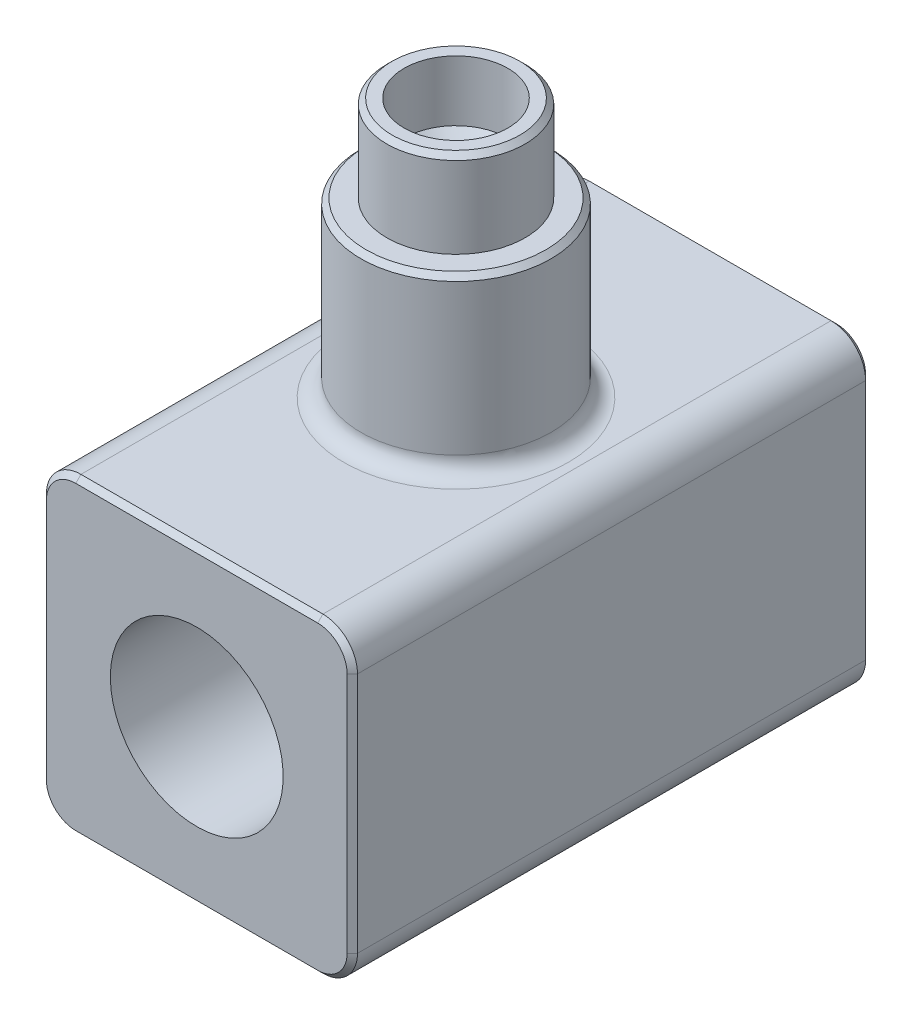
ISO-10303-21;
HEADER;
FILE_DESCRIPTION(('STEP AP214'),'2;1');
FILE_NAME('part.step','',(''),(''),'','','');
FILE_SCHEMA(('AUTOMOTIVE_DESIGN { 1 0 10303 214 1 1 1 1 }'));
ENDSEC;
DATA;
#1=APPLICATION_CONTEXT('core data for automotive mechanical design processes');
#2=APPLICATION_PROTOCOL_DEFINITION('international standard','automotive_design',2000,#1);
#3=PRODUCT_CONTEXT('',#1,'mechanical');
#4=PRODUCT('Part','Part','',(#3));
#5=PRODUCT_RELATED_PRODUCT_CATEGORY('part','',(#4));
#6=PRODUCT_DEFINITION_FORMATION('','',#4);
#7=PRODUCT_DEFINITION_CONTEXT('part definition',#1,'design');
#8=PRODUCT_DEFINITION('design','',#6,#7);
#9=PRODUCT_DEFINITION_SHAPE('','',#8);
#10=(LENGTH_UNIT() NAMED_UNIT(*) SI_UNIT(.MILLI.,.METRE.));
#11=(NAMED_UNIT(*) PLANE_ANGLE_UNIT() SI_UNIT($,.RADIAN.));
#12=(NAMED_UNIT(*) SI_UNIT($,.STERADIAN.) SOLID_ANGLE_UNIT());
#13=UNCERTAINTY_MEASURE_WITH_UNIT(LENGTH_MEASURE(1.E-05),#10,'distance_accuracy_value','');
#14=(GEOMETRIC_REPRESENTATION_CONTEXT(3) GLOBAL_UNCERTAINTY_ASSIGNED_CONTEXT((#13)) GLOBAL_UNIT_ASSIGNED_CONTEXT((#10,
#11,#12)) REPRESENTATION_CONTEXT('',''));
#15=CARTESIAN_POINT('',(0.,0.,0.));
#16=DIRECTION('',(0.,0.,1.));
#17=DIRECTION('',(1.,0.,0.));
#18=AXIS2_PLACEMENT_3D('',#15,#16,#17);
#19=CARTESIAN_POINT('',(-9.,-9.00000000000001,30.));
#20=DIRECTION('',(1.,0.,0.));
#21=DIRECTION('',(0.,0.,-1.));
#22=AXIS2_PLACEMENT_3D('',#19,#20,#21);
#23=PLANE('',#22);
#24=DIRECTION('',(0.,0.,-1.));
#25=VECTOR('',#24,1.);
#26=CARTESIAN_POINT('',(-9.,-7.00000000000001,30.));
#27=LINE('',#26,#25);
#28=CARTESIAN_POINT('',(-9.,-7.00000000000001,0.300000000000009));
#29=VERTEX_POINT('',#28);
#30=CARTESIAN_POINT('',(-9.,-7.00000000000001,29.7));
#31=VERTEX_POINT('',#30);
#32=EDGE_CURVE('E413',#29,#31,#27,.F.);
#33=ORIENTED_EDGE('',*,*,#32,.T.);
#34=DIRECTION('',(0.,1.,0.));
#35=VECTOR('',#34,1.);
#36=CARTESIAN_POINT('',(-9.,6.99999999999999,29.7));
#37=LINE('',#36,#35);
#38=CARTESIAN_POINT('',(-9.,6.99999999999999,29.7));
#39=VERTEX_POINT('',#38);
#40=EDGE_CURVE('E344',#31,#39,#37,.T.);
#41=ORIENTED_EDGE('',*,*,#40,.T.);
#42=DIRECTION('',(0.,0.,-1.));
#43=VECTOR('',#42,1.);
#44=CARTESIAN_POINT('',(-9.,6.99999999999999,30.));
#45=LINE('',#44,#43);
#46=CARTESIAN_POINT('',(-9.,6.99999999999999,0.300000000000009));
#47=VERTEX_POINT('',#46);
#48=EDGE_CURVE('E417',#39,#47,#45,.T.);
#49=ORIENTED_EDGE('',*,*,#48,.T.);
#50=DIRECTION('',(0.,-1.,0.));
#51=VECTOR('',#50,1.);
#52=CARTESIAN_POINT('',(-9.,-9.00000000000001,0.300000000000009));
#53=LINE('',#52,#51);
#54=EDGE_CURVE('E348',#47,#29,#53,.T.);
#55=ORIENTED_EDGE('',*,*,#54,.T.);
#56=EDGE_LOOP('',(#33,#41,#49,#55));
#57=FACE_BOUND('',#56,.T.);
#58=ADVANCED_FACE('F47',(#57),#23,.F.);
#59=CARTESIAN_POINT('',(9.,-9.,30.));
#60=DIRECTION('',(0.,1.,0.));
#61=DIRECTION('',(-1.,0.,0.));
#62=AXIS2_PLACEMENT_3D('',#59,#60,#61);
#63=PLANE('',#62);
#64=DIRECTION('',(0.,0.,-1.));
#65=VECTOR('',#64,1.);
#66=CARTESIAN_POINT('',(7.,-9.,30.));
#67=LINE('',#66,#65);
#68=CARTESIAN_POINT('',(7.,-9.,0.300000000000009));
#69=VERTEX_POINT('',#68);
#70=CARTESIAN_POINT('',(7.,-9.,29.7));
#71=VERTEX_POINT('',#70);
#72=EDGE_CURVE('E420',#69,#71,#67,.F.);
#73=ORIENTED_EDGE('',*,*,#72,.T.);
#74=DIRECTION('',(-1.,0.,0.));
#75=VECTOR('',#74,1.);
#76=CARTESIAN_POINT('',(-7.,-9.00000000000001,29.7));
#77=LINE('',#76,#75);
#78=CARTESIAN_POINT('',(-7.,-9.00000000000001,29.7));
#79=VERTEX_POINT('',#78);
#80=EDGE_CURVE('E263',#71,#79,#77,.T.);
#81=ORIENTED_EDGE('',*,*,#80,.T.);
#82=DIRECTION('',(0.,0.,-1.));
#83=VECTOR('',#82,1.);
#84=CARTESIAN_POINT('',(-7.,-9.00000000000001,30.));
#85=LINE('',#84,#83);
#86=CARTESIAN_POINT('',(-7.,-9.00000000000001,0.300000000000009));
#87=VERTEX_POINT('',#86);
#88=EDGE_CURVE('E423',#79,#87,#85,.T.);
#89=ORIENTED_EDGE('',*,*,#88,.T.);
#90=DIRECTION('',(1.,0.,0.));
#91=VECTOR('',#90,1.);
#92=CARTESIAN_POINT('',(9.,-9.,0.300000000000009));
#93=LINE('',#92,#91);
#94=EDGE_CURVE('E271',#87,#69,#93,.T.);
#95=ORIENTED_EDGE('',*,*,#94,.T.);
#96=EDGE_LOOP('',(#73,#81,#89,#95));
#97=FACE_BOUND('',#96,.T.);
#98=ADVANCED_FACE('F493',(#97),#63,.F.);
#99=CARTESIAN_POINT('',(9.,-9.,30.));
#100=DIRECTION('',(-1.,0.,0.));
#101=DIRECTION('',(0.,0.,1.));
#102=AXIS2_PLACEMENT_3D('',#99,#100,#101);
#103=PLANE('',#102);
#104=DIRECTION('',(0.,0.,-1.));
#105=VECTOR('',#104,1.);
#106=CARTESIAN_POINT('',(9.,7.,30.));
#107=LINE('',#106,#105);
#108=CARTESIAN_POINT('',(9.,7.,0.300000000000009));
#109=VERTEX_POINT('',#108);
#110=CARTESIAN_POINT('',(9.,7.,29.7));
#111=VERTEX_POINT('',#110);
#112=EDGE_CURVE('E430',#109,#111,#107,.F.);
#113=ORIENTED_EDGE('',*,*,#112,.T.);
#114=DIRECTION('',(0.,-1.,0.));
#115=VECTOR('',#114,1.);
#116=CARTESIAN_POINT('',(9.,-7.,29.7));
#117=LINE('',#116,#115);
#118=CARTESIAN_POINT('',(9.,-7.,29.7));
#119=VERTEX_POINT('',#118);
#120=EDGE_CURVE('E297',#111,#119,#117,.T.);
#121=ORIENTED_EDGE('',*,*,#120,.T.);
#122=DIRECTION('',(0.,0.,-1.));
#123=VECTOR('',#122,1.);
#124=CARTESIAN_POINT('',(9.,-7.,30.));
#125=LINE('',#124,#123);
#126=CARTESIAN_POINT('',(9.,-7.,0.300000000000009));
#127=VERTEX_POINT('',#126);
#128=EDGE_CURVE('E426',#119,#127,#125,.T.);
#129=ORIENTED_EDGE('',*,*,#128,.T.);
#130=DIRECTION('',(0.,1.,0.));
#131=VECTOR('',#130,1.);
#132=CARTESIAN_POINT('',(9.,-9.,0.300000000000009));
#133=LINE('',#132,#131);
#134=EDGE_CURVE('E294',#127,#109,#133,.T.);
#135=ORIENTED_EDGE('',*,*,#134,.T.);
#136=EDGE_LOOP('',(#113,#121,#129,#135));
#137=FACE_BOUND('',#136,.T.);
#138=ADVANCED_FACE('F499',(#137),#103,.F.);
#139=CARTESIAN_POINT('',(9.,9.,30.));
#140=DIRECTION('',(0.,-1.,0.));
#141=DIRECTION('',(1.,0.,0.));
#142=AXIS2_PLACEMENT_3D('',#139,#140,#141);
#143=PLANE('',#142);
#144=CARTESIAN_POINT('',(0.,8.99999999999999,15.));
#145=DIRECTION('',(0.,-1.,0.));
#146=DIRECTION('',(1.,0.,0.));
#147=AXIS2_PLACEMENT_3D('',#144,#145,#146);
#148=CIRCLE('',#147,6.5);
#149=CARTESIAN_POINT('',(6.5,9.,15.));
#150=VERTEX_POINT('',#149);
#151=EDGE_CURVE('E383',#150,#150,#148,.T.);
#152=ORIENTED_EDGE('',*,*,#151,.T.);
#153=EDGE_LOOP('',(#152));
#154=FACE_BOUND('',#153,.T.);
#155=DIRECTION('',(0.,0.,-1.));
#156=VECTOR('',#155,1.);
#157=CARTESIAN_POINT('',(-7.,8.99999999999999,30.));
#158=LINE('',#157,#156);
#159=CARTESIAN_POINT('',(-7.,8.99999999999999,0.300000000000009));
#160=VERTEX_POINT('',#159);
#161=CARTESIAN_POINT('',(-7.,8.99999999999999,29.7));
#162=VERTEX_POINT('',#161);
#163=EDGE_CURVE('E409',#160,#162,#158,.F.);
#164=ORIENTED_EDGE('',*,*,#163,.T.);
#165=DIRECTION('',(1.,0.,0.));
#166=VECTOR('',#165,1.);
#167=CARTESIAN_POINT('',(7.,9.,29.7));
#168=LINE('',#167,#166);
#169=CARTESIAN_POINT('',(7.,9.,29.7));
#170=VERTEX_POINT('',#169);
#171=EDGE_CURVE('E275',#162,#170,#168,.T.);
#172=ORIENTED_EDGE('',*,*,#171,.T.);
#173=DIRECTION('',(0.,0.,-1.));
#174=VECTOR('',#173,1.);
#175=CARTESIAN_POINT('',(7.,9.,30.));
#176=LINE('',#175,#174);
#177=CARTESIAN_POINT('',(7.,9.,0.300000000000009));
#178=VERTEX_POINT('',#177);
#179=EDGE_CURVE('E405',#170,#178,#176,.T.);
#180=ORIENTED_EDGE('',*,*,#179,.T.);
#181=DIRECTION('',(-1.,0.,0.));
#182=VECTOR('',#181,1.);
#183=CARTESIAN_POINT('',(9.,9.,0.300000000000009));
#184=LINE('',#183,#182);
#185=EDGE_CURVE('E270',#178,#160,#184,.T.);
#186=ORIENTED_EDGE('',*,*,#185,.T.);
#187=EDGE_LOOP('',(#164,#172,#180,#186));
#188=FACE_BOUND('',#187,.T.);
#189=ADVANCED_FACE('F489',(#154,#188),#143,.F.);
#190=CARTESIAN_POINT('',(0.,0.,30.));
#191=DIRECTION('',(0.,0.,1.));
#192=DIRECTION('',(1.,0.,0.));
#193=AXIS2_PLACEMENT_3D('',#190,#191,#192);
#194=PLANE('',#193);
#195=CARTESIAN_POINT('',(-7.,6.99999999999999,30.));
#196=DIRECTION('',(0.,0.,1.));
#197=DIRECTION('',(1.,0.,0.));
#198=AXIS2_PLACEMENT_3D('',#195,#196,#197);
#199=CIRCLE('',#198,1.7);
#200=CARTESIAN_POINT('',(-7.,8.69999999999999,30.));
#201=VERTEX_POINT('',#200);
#202=CARTESIAN_POINT('',(-8.7,6.99999999999999,30.));
#203=VERTEX_POINT('',#202);
#204=EDGE_CURVE('E359',#201,#203,#199,.T.);
#205=ORIENTED_EDGE('',*,*,#204,.T.);
#206=DIRECTION('',(0.,-1.,0.));
#207=VECTOR('',#206,1.);
#208=CARTESIAN_POINT('',(-8.7,-7.00000000000001,30.));
#209=LINE('',#208,#207);
#210=CARTESIAN_POINT('',(-8.7,-7.00000000000001,30.));
#211=VERTEX_POINT('',#210);
#212=EDGE_CURVE('E352',#203,#211,#209,.T.);
#213=ORIENTED_EDGE('',*,*,#212,.T.);
#214=CARTESIAN_POINT('',(-7.,-7.00000000000001,30.));
#215=DIRECTION('',(0.,0.,1.));
#216=DIRECTION('',(1.,0.,0.));
#217=AXIS2_PLACEMENT_3D('',#214,#215,#216);
#218=CIRCLE('',#217,1.7);
#219=CARTESIAN_POINT('',(-7.,-8.7,30.));
#220=VERTEX_POINT('',#219);
#221=EDGE_CURVE('E356',#211,#220,#218,.T.);
#222=ORIENTED_EDGE('',*,*,#221,.T.);
#223=DIRECTION('',(1.,0.,0.));
#224=VECTOR('',#223,1.);
#225=CARTESIAN_POINT('',(7.,-8.7,30.));
#226=LINE('',#225,#224);
#227=CARTESIAN_POINT('',(7.,-8.7,30.));
#228=VERTEX_POINT('',#227);
#229=EDGE_CURVE('E170',#220,#228,#226,.T.);
#230=ORIENTED_EDGE('',*,*,#229,.T.);
#231=CARTESIAN_POINT('',(7.,-7.,30.));
#232=DIRECTION('',(0.,0.,1.));
#233=DIRECTION('',(1.,0.,0.));
#234=AXIS2_PLACEMENT_3D('',#231,#232,#233);
#235=CIRCLE('',#234,1.7);
#236=CARTESIAN_POINT('',(8.7,-7.,30.));
#237=VERTEX_POINT('',#236);
#238=EDGE_CURVE('E163',#228,#237,#235,.T.);
#239=ORIENTED_EDGE('',*,*,#238,.T.);
#240=DIRECTION('',(0.,1.,0.));
#241=VECTOR('',#240,1.);
#242=CARTESIAN_POINT('',(8.7,7.,30.));
#243=LINE('',#242,#241);
#244=CARTESIAN_POINT('',(8.7,7.,30.));
#245=VERTEX_POINT('',#244);
#246=EDGE_CURVE('E167',#237,#245,#243,.T.);
#247=ORIENTED_EDGE('',*,*,#246,.T.);
#248=CARTESIAN_POINT('',(7.,7.,30.));
#249=DIRECTION('',(0.,0.,1.));
#250=DIRECTION('',(1.,0.,0.));
#251=AXIS2_PLACEMENT_3D('',#248,#249,#250);
#252=CIRCLE('',#251,1.7);
#253=CARTESIAN_POINT('',(7.,8.69999999999999,30.));
#254=VERTEX_POINT('',#253);
#255=EDGE_CURVE('E177',#245,#254,#252,.T.);
#256=ORIENTED_EDGE('',*,*,#255,.T.);
#257=DIRECTION('',(-1.,0.,0.));
#258=VECTOR('',#257,1.);
#259=CARTESIAN_POINT('',(-7.,8.69999999999999,30.));
#260=LINE('',#259,#258);
#261=EDGE_CURVE('E176',#254,#201,#260,.T.);
#262=ORIENTED_EDGE('',*,*,#261,.T.);
#263=EDGE_LOOP('',(#205,#213,#222,#230,#239,#247,#256,#262));
#264=FACE_BOUND('',#263,.T.);
#265=CARTESIAN_POINT('',(0.,0.,30.));
#266=DIRECTION('',(0.,0.,-1.));
#267=DIRECTION('',(-1.,0.,0.));
#268=AXIS2_PLACEMENT_3D('',#265,#266,#267);
#269=CIRCLE('',#268,5.);
#270=CARTESIAN_POINT('',(-5.,0.,30.));
#271=VERTEX_POINT('',#270);
#272=EDGE_CURVE('E443',#271,#271,#269,.T.);
#273=ORIENTED_EDGE('',*,*,#272,.T.);
#274=EDGE_LOOP('',(#273));
#275=FACE_BOUND('',#274,.T.);
#276=ADVANCED_FACE('F165',(#264,#275),#194,.T.);
#277=CARTESIAN_POINT('',(0.,0.,0.));
#278=DIRECTION('',(0.,0.,1.));
#279=DIRECTION('',(1.,0.,0.));
#280=AXIS2_PLACEMENT_3D('',#277,#278,#279);
#281=PLANE('',#280);
#282=CARTESIAN_POINT('',(-7.,-7.00000000000001,0.));
#283=DIRECTION('',(0.,0.,1.));
#284=DIRECTION('',(1.,0.,0.));
#285=AXIS2_PLACEMENT_3D('',#282,#283,#284);
#286=CIRCLE('',#285,1.69999999999999);
#287=CARTESIAN_POINT('',(-7.,-8.7,0.));
#288=VERTEX_POINT('',#287);
#289=CARTESIAN_POINT('',(-8.69999999999999,-7.00000000000001,0.));
#290=VERTEX_POINT('',#289);
#291=EDGE_CURVE('E58',#288,#290,#286,.F.);
#292=ORIENTED_EDGE('',*,*,#291,.T.);
#293=DIRECTION('',(0.,1.,0.));
#294=VECTOR('',#293,1.);
#295=CARTESIAN_POINT('',(-8.69999999999999,0.,0.));
#296=LINE('',#295,#294);
#297=CARTESIAN_POINT('',(-8.69999999999999,6.99999999999999,0.));
#298=VERTEX_POINT('',#297);
#299=EDGE_CURVE('E11',#290,#298,#296,.T.);
#300=ORIENTED_EDGE('',*,*,#299,.T.);
#301=CARTESIAN_POINT('',(-7.,6.99999999999999,0.));
#302=DIRECTION('',(0.,0.,1.));
#303=DIRECTION('',(1.,0.,0.));
#304=AXIS2_PLACEMENT_3D('',#301,#302,#303);
#305=CIRCLE('',#304,1.69999999999999);
#306=CARTESIAN_POINT('',(-7.,8.69999999999998,0.));
#307=VERTEX_POINT('',#306);
#308=EDGE_CURVE('E315',#298,#307,#305,.F.);
#309=ORIENTED_EDGE('',*,*,#308,.T.);
#310=DIRECTION('',(1.,0.,0.));
#311=VECTOR('',#310,1.);
#312=CARTESIAN_POINT('',(0.,8.69999999999999,0.));
#313=LINE('',#312,#311);
#314=CARTESIAN_POINT('',(7.,8.69999999999999,0.));
#315=VERTEX_POINT('',#314);
#316=EDGE_CURVE('E309',#307,#315,#313,.T.);
#317=ORIENTED_EDGE('',*,*,#316,.T.);
#318=CARTESIAN_POINT('',(7.,7.,0.));
#319=DIRECTION('',(0.,0.,1.));
#320=DIRECTION('',(1.,0.,0.));
#321=AXIS2_PLACEMENT_3D('',#318,#319,#320);
#322=CIRCLE('',#321,1.69999999999999);
#323=CARTESIAN_POINT('',(8.69999999999999,7.,0.));
#324=VERTEX_POINT('',#323);
#325=EDGE_CURVE('E303',#315,#324,#322,.F.);
#326=ORIENTED_EDGE('',*,*,#325,.T.);
#327=DIRECTION('',(0.,-1.,0.));
#328=VECTOR('',#327,1.);
#329=CARTESIAN_POINT('',(8.69999999999999,0.,0.));
#330=LINE('',#329,#328);
#331=CARTESIAN_POINT('',(8.69999999999999,-7.,0.));
#332=VERTEX_POINT('',#331);
#333=EDGE_CURVE('E300',#324,#332,#330,.T.);
#334=ORIENTED_EDGE('',*,*,#333,.T.);
#335=CARTESIAN_POINT('',(7.,-7.,0.));
#336=DIRECTION('',(0.,0.,1.));
#337=DIRECTION('',(1.,0.,0.));
#338=AXIS2_PLACEMENT_3D('',#335,#336,#337);
#339=CIRCLE('',#338,1.69999999999999);
#340=CARTESIAN_POINT('',(7.,-8.69999999999999,0.));
#341=VERTEX_POINT('',#340);
#342=EDGE_CURVE('E306',#332,#341,#339,.F.);
#343=ORIENTED_EDGE('',*,*,#342,.T.);
#344=DIRECTION('',(-1.,0.,0.));
#345=VECTOR('',#344,1.);
#346=CARTESIAN_POINT('',(0.,-8.7,0.));
#347=LINE('',#346,#345);
#348=EDGE_CURVE('E312',#341,#288,#347,.T.);
#349=ORIENTED_EDGE('',*,*,#348,.T.);
#350=EDGE_LOOP('',(#292,#300,#309,#317,#326,#334,#343,#349));
#351=FACE_BOUND('',#350,.T.);
#352=CARTESIAN_POINT('',(0.,0.,0.));
#353=DIRECTION('',(0.,0.,-1.));
#354=DIRECTION('',(-1.,0.,0.));
#355=AXIS2_PLACEMENT_3D('',#352,#353,#354);
#356=CIRCLE('',#355,5.);
#357=CARTESIAN_POINT('',(-5.,0.,0.));
#358=VERTEX_POINT('',#357);
#359=EDGE_CURVE('E435',#358,#358,#356,.T.);
#360=ORIENTED_EDGE('',*,*,#359,.F.);
#361=EDGE_LOOP('',(#360));
#362=FACE_BOUND('',#361,.T.);
#363=ADVANCED_FACE('F319',(#351,#362),#281,.F.);
#364=CARTESIAN_POINT('',(7.,-7.,30.));
#365=DIRECTION('',(0.,0.,-1.));
#366=DIRECTION('',(-1.,0.,0.));
#367=AXIS2_PLACEMENT_3D('',#364,#365,#366);
#368=CYLINDRICAL_SURFACE('',#367,2.);
#369=ORIENTED_EDGE('',*,*,#128,.F.);
#370=CARTESIAN_POINT('',(7.,-7.,29.7));
#371=DIRECTION('',(0.,0.,1.));
#372=DIRECTION('',(1.,0.,0.));
#373=AXIS2_PLACEMENT_3D('',#370,#371,#372);
#374=CIRCLE('',#373,2.);
#375=EDGE_CURVE('E192',#119,#71,#374,.F.);
#376=ORIENTED_EDGE('',*,*,#375,.T.);
#377=ORIENTED_EDGE('',*,*,#72,.F.);
#378=CARTESIAN_POINT('',(7.,-7.,0.300000000000009));
#379=DIRECTION('',(0.,0.,1.));
#380=DIRECTION('',(1.,0.,0.));
#381=AXIS2_PLACEMENT_3D('',#378,#379,#380);
#382=CIRCLE('',#381,2.);
#383=EDGE_CURVE('E283',#69,#127,#382,.T.);
#384=ORIENTED_EDGE('',*,*,#383,.T.);
#385=EDGE_LOOP('',(#369,#376,#377,#384));
#386=FACE_BOUND('',#385,.T.);
#387=ADVANCED_FACE('F480',(#386),#368,.T.);
#388=CARTESIAN_POINT('',(-7.,-7.00000000000001,30.));
#389=DIRECTION('',(0.,0.,-1.));
#390=DIRECTION('',(-1.,0.,0.));
#391=AXIS2_PLACEMENT_3D('',#388,#389,#390);
#392=CYLINDRICAL_SURFACE('',#391,2.);
#393=ORIENTED_EDGE('',*,*,#88,.F.);
#394=CARTESIAN_POINT('',(-7.,-7.00000000000001,29.7));
#395=DIRECTION('',(0.,0.,1.));
#396=DIRECTION('',(1.,0.,0.));
#397=AXIS2_PLACEMENT_3D('',#394,#395,#396);
#398=CIRCLE('',#397,2.);
#399=EDGE_CURVE('E335',#79,#31,#398,.F.);
#400=ORIENTED_EDGE('',*,*,#399,.T.);
#401=ORIENTED_EDGE('',*,*,#32,.F.);
#402=CARTESIAN_POINT('',(-7.,-7.00000000000001,0.300000000000009));
#403=DIRECTION('',(0.,0.,1.));
#404=DIRECTION('',(1.,0.,0.));
#405=AXIS2_PLACEMENT_3D('',#402,#403,#404);
#406=CIRCLE('',#405,2.);
#407=EDGE_CURVE('E339',#29,#87,#406,.T.);
#408=ORIENTED_EDGE('',*,*,#407,.T.);
#409=EDGE_LOOP('',(#393,#400,#401,#408));
#410=FACE_BOUND('',#409,.T.);
#411=ADVANCED_FACE('F486',(#410),#392,.T.);
#412=CARTESIAN_POINT('',(7.,7.,30.));
#413=DIRECTION('',(0.,0.,-1.));
#414=DIRECTION('',(-1.,0.,0.));
#415=AXIS2_PLACEMENT_3D('',#412,#413,#414);
#416=CYLINDRICAL_SURFACE('',#415,2.);
#417=ORIENTED_EDGE('',*,*,#179,.F.);
#418=CARTESIAN_POINT('',(7.,7.,29.7));
#419=DIRECTION('',(0.,0.,1.));
#420=DIRECTION('',(1.,0.,0.));
#421=AXIS2_PLACEMENT_3D('',#418,#419,#420);
#422=CIRCLE('',#421,2.);
#423=EDGE_CURVE('E291',#170,#111,#422,.F.);
#424=ORIENTED_EDGE('',*,*,#423,.T.);
#425=ORIENTED_EDGE('',*,*,#112,.F.);
#426=CARTESIAN_POINT('',(7.,7.,0.300000000000009));
#427=DIRECTION('',(0.,0.,1.));
#428=DIRECTION('',(1.,0.,0.));
#429=AXIS2_PLACEMENT_3D('',#426,#427,#428);
#430=CIRCLE('',#429,2.);
#431=EDGE_CURVE('E288',#109,#178,#430,.T.);
#432=ORIENTED_EDGE('',*,*,#431,.T.);
#433=EDGE_LOOP('',(#417,#424,#425,#432));
#434=FACE_BOUND('',#433,.T.);
#435=ADVANCED_FACE('F505',(#434),#416,.T.);
#436=CARTESIAN_POINT('',(-7.,6.99999999999999,30.));
#437=DIRECTION('',(0.,0.,-1.));
#438=DIRECTION('',(-1.,0.,0.));
#439=AXIS2_PLACEMENT_3D('',#436,#437,#438);
#440=CYLINDRICAL_SURFACE('',#439,2.);
#441=ORIENTED_EDGE('',*,*,#48,.F.);
#442=CARTESIAN_POINT('',(-7.,6.99999999999999,29.7));
#443=DIRECTION('',(0.,0.,1.));
#444=DIRECTION('',(1.,0.,0.));
#445=AXIS2_PLACEMENT_3D('',#442,#443,#444);
#446=CIRCLE('',#445,2.);
#447=EDGE_CURVE('E277',#39,#162,#446,.F.);
#448=ORIENTED_EDGE('',*,*,#447,.T.);
#449=ORIENTED_EDGE('',*,*,#163,.F.);
#450=CARTESIAN_POINT('',(-7.,6.99999999999999,0.300000000000009));
#451=DIRECTION('',(0.,0.,1.));
#452=DIRECTION('',(1.,0.,0.));
#453=AXIS2_PLACEMENT_3D('',#450,#451,#452);
#454=CIRCLE('',#453,2.);
#455=EDGE_CURVE('E329',#160,#47,#454,.T.);
#456=ORIENTED_EDGE('',*,*,#455,.T.);
#457=EDGE_LOOP('',(#441,#448,#449,#456));
#458=FACE_BOUND('',#457,.T.);
#459=ADVANCED_FACE('F476',(#458),#440,.T.);
#460=CARTESIAN_POINT('',(0.,0.,12.));
#461=DIRECTION('',(0.,0.,-1.));
#462=DIRECTION('',(-1.,0.,0.));
#463=AXIS2_PLACEMENT_3D('',#460,#461,#462);
#464=CYLINDRICAL_SURFACE('',#463,5.);
#465=CARTESIAN_POINT('',(0.,0.,12.));
#466=DIRECTION('',(0.,0.,-1.));
#467=DIRECTION('',(-1.,0.,0.));
#468=AXIS2_PLACEMENT_3D('',#465,#466,#467);
#469=CIRCLE('',#468,5.);
#470=CARTESIAN_POINT('',(-5.,0.,12.));
#471=VERTEX_POINT('',#470);
#472=EDGE_CURVE('E434',#471,#471,#469,.T.);
#473=ORIENTED_EDGE('',*,*,#472,.F.);
#474=EDGE_LOOP('',(#473));
#475=FACE_BOUND('',#474,.T.);
#476=ORIENTED_EDGE('',*,*,#359,.T.);
#477=EDGE_LOOP('',(#476));
#478=FACE_BOUND('',#477,.T.);
#479=ADVANCED_FACE('F470',(#475,#478),#464,.F.);
#480=CARTESIAN_POINT('',(0.,0.,12.));
#481=DIRECTION('',(0.,0.,-1.));
#482=DIRECTION('',(-1.,0.,0.));
#483=AXIS2_PLACEMENT_3D('',#480,#481,#482);
#484=PLANE('',#483);
#485=CARTESIAN_POINT('',(0.,0.,12.));
#486=DIRECTION('',(0.,0.,-1.));
#487=DIRECTION('',(-1.,0.,0.));
#488=AXIS2_PLACEMENT_3D('',#485,#486,#487);
#489=CIRCLE('',#488,1.5);
#490=CARTESIAN_POINT('',(-1.5,0.,12.));
#491=VERTEX_POINT('',#490);
#492=EDGE_CURVE('E198',#491,#491,#489,.T.);
#493=ORIENTED_EDGE('',*,*,#492,.F.);
#494=EDGE_LOOP('',(#493));
#495=FACE_BOUND('',#494,.T.);
#496=ORIENTED_EDGE('',*,*,#472,.T.);
#497=EDGE_LOOP('',(#496));
#498=FACE_BOUND('',#497,.T.);
#499=ADVANCED_FACE('F466',(#495,#498),#484,.T.);
#500=CARTESIAN_POINT('',(0.,0.,18.));
#501=DIRECTION('',(0.,0.,1.));
#502=DIRECTION('',(1.,0.,0.));
#503=AXIS2_PLACEMENT_3D('',#500,#501,#502);
#504=CYLINDRICAL_SURFACE('',#503,5.);
#505=CARTESIAN_POINT('',(0.,0.,18.));
#506=DIRECTION('',(0.,0.,-1.));
#507=DIRECTION('',(-1.,0.,0.));
#508=AXIS2_PLACEMENT_3D('',#505,#506,#507);
#509=CIRCLE('',#508,5.);
#510=CARTESIAN_POINT('',(-5.,0.,18.));
#511=VERTEX_POINT('',#510);
#512=EDGE_CURVE('E439',#511,#511,#509,.T.);
#513=ORIENTED_EDGE('',*,*,#512,.T.);
#514=EDGE_LOOP('',(#513));
#515=FACE_BOUND('',#514,.T.);
#516=ORIENTED_EDGE('',*,*,#272,.F.);
#517=EDGE_LOOP('',(#516));
#518=FACE_BOUND('',#517,.T.);
#519=ADVANCED_FACE('F469',(#515,#518),#504,.F.);
#520=CARTESIAN_POINT('',(0.,0.,18.));
#521=DIRECTION('',(0.,0.,1.));
#522=DIRECTION('',(-1.,0.,0.));
#523=AXIS2_PLACEMENT_3D('',#520,#521,#522);
#524=PLANE('',#523);
#525=CARTESIAN_POINT('',(0.,0.,18.));
#526=DIRECTION('',(0.,0.,1.));
#527=DIRECTION('',(1.,0.,0.));
#528=AXIS2_PLACEMENT_3D('',#525,#526,#527);
#529=CIRCLE('',#528,1.5);
#530=CARTESIAN_POINT('',(1.5,0.,18.));
#531=VERTEX_POINT('',#530);
#532=EDGE_CURVE('E384',#531,#531,#529,.T.);
#533=ORIENTED_EDGE('',*,*,#532,.F.);
#534=EDGE_LOOP('',(#533));
#535=FACE_BOUND('',#534,.T.);
#536=ORIENTED_EDGE('',*,*,#512,.F.);
#537=EDGE_LOOP('',(#536));
#538=FACE_BOUND('',#537,.T.);
#539=ADVANCED_FACE('F670',(#535,#538),#524,.T.);
#540=CARTESIAN_POINT('',(0.,19.,15.));
#541=DIRECTION('',(0.,-1.,0.));
#542=DIRECTION('',(1.,0.,0.));
#543=AXIS2_PLACEMENT_3D('',#540,#541,#542);
#544=CYLINDRICAL_SURFACE('',#543,5.5);
#545=CARTESIAN_POINT('',(0.,18.7,15.));
#546=DIRECTION('',(0.,1.,0.));
#547=DIRECTION('',(-1.,0.,0.));
#548=AXIS2_PLACEMENT_3D('',#545,#546,#547);
#549=CIRCLE('',#548,5.5);
#550=CARTESIAN_POINT('',(-5.5,18.7,15.));
#551=VERTEX_POINT('',#550);
#552=EDGE_CURVE('E189',#551,#551,#549,.F.);
#553=ORIENTED_EDGE('',*,*,#552,.T.);
#554=EDGE_LOOP('',(#553));
#555=FACE_BOUND('',#554,.T.);
#556=CARTESIAN_POINT('',(0.,9.99999999999999,15.));
#557=DIRECTION('',(0.,-1.,0.));
#558=DIRECTION('',(1.,0.,0.));
#559=AXIS2_PLACEMENT_3D('',#556,#557,#558);
#560=CIRCLE('',#559,5.5);
#561=CARTESIAN_POINT('',(5.5,9.99999999999999,15.));
#562=VERTEX_POINT('',#561);
#563=EDGE_CURVE('E392',#562,#562,#560,.F.);
#564=ORIENTED_EDGE('',*,*,#563,.T.);
#565=EDGE_LOOP('',(#564));
#566=FACE_BOUND('',#565,.T.);
#567=ADVANCED_FACE('F667',(#555,#566),#544,.T.);
#568=CARTESIAN_POINT('',(0.,19.,15.));
#569=DIRECTION('',(0.,1.,0.));
#570=DIRECTION('',(-1.,0.,0.));
#571=AXIS2_PLACEMENT_3D('',#568,#569,#570);
#572=PLANE('',#571);
#573=CARTESIAN_POINT('',(0.,19.,15.));
#574=DIRECTION('',(0.,1.,0.));
#575=DIRECTION('',(-1.,0.,0.));
#576=AXIS2_PLACEMENT_3D('',#573,#574,#575);
#577=CIRCLE('',#576,5.2);
#578=CARTESIAN_POINT('',(-5.2,19.,15.));
#579=VERTEX_POINT('',#578);
#580=EDGE_CURVE('E371',#579,#579,#577,.T.);
#581=ORIENTED_EDGE('',*,*,#580,.T.);
#582=EDGE_LOOP('',(#581));
#583=FACE_BOUND('',#582,.T.);
#584=CARTESIAN_POINT('',(0.,19.,15.));
#585=DIRECTION('',(0.,1.,0.));
#586=DIRECTION('',(-1.,0.,0.));
#587=AXIS2_PLACEMENT_3D('',#584,#585,#586);
#588=CIRCLE('',#587,4.);
#589=CARTESIAN_POINT('',(-4.,19.,15.));
#590=VERTEX_POINT('',#589);
#591=EDGE_CURVE('E404',#590,#590,#588,.T.);
#592=ORIENTED_EDGE('',*,*,#591,.F.);
#593=EDGE_LOOP('',(#592));
#594=FACE_BOUND('',#593,.T.);
#595=ADVANCED_FACE('F669',(#583,#594),#572,.T.);
#596=CARTESIAN_POINT('',(0.,24.,15.));
#597=DIRECTION('',(0.,-1.,0.));
#598=DIRECTION('',(1.,0.,0.));
#599=AXIS2_PLACEMENT_3D('',#596,#597,#598);
#600=CYLINDRICAL_SURFACE('',#599,4.);
#601=CARTESIAN_POINT('',(0.,23.7,15.));
#602=DIRECTION('',(0.,1.,0.));
#603=DIRECTION('',(-1.,0.,0.));
#604=AXIS2_PLACEMENT_3D('',#601,#602,#603);
#605=CIRCLE('',#604,4.);
#606=CARTESIAN_POINT('',(-4.,23.7,15.));
#607=VERTEX_POINT('',#606);
#608=EDGE_CURVE('E375',#607,#607,#605,.F.);
#609=ORIENTED_EDGE('',*,*,#608,.T.);
#610=EDGE_LOOP('',(#609));
#611=FACE_BOUND('',#610,.T.);
#612=ORIENTED_EDGE('',*,*,#591,.T.);
#613=EDGE_LOOP('',(#612));
#614=FACE_BOUND('',#613,.T.);
#615=ADVANCED_FACE('F677',(#611,#614),#600,.T.);
#616=CARTESIAN_POINT('',(0.,24.,15.));
#617=DIRECTION('',(0.,1.,0.));
#618=DIRECTION('',(-1.,0.,0.));
#619=AXIS2_PLACEMENT_3D('',#616,#617,#618);
#620=PLANE('',#619);
#621=CARTESIAN_POINT('',(0.,24.,15.));
#622=DIRECTION('',(0.,1.,0.));
#623=DIRECTION('',(-1.,0.,0.));
#624=AXIS2_PLACEMENT_3D('',#621,#622,#623);
#625=CIRCLE('',#624,3.7);
#626=CARTESIAN_POINT('',(-3.70000000000001,24.,15.));
#627=VERTEX_POINT('',#626);
#628=EDGE_CURVE('E379',#627,#627,#625,.T.);
#629=ORIENTED_EDGE('',*,*,#628,.T.);
#630=EDGE_LOOP('',(#629));
#631=FACE_BOUND('',#630,.T.);
#632=CARTESIAN_POINT('',(0.,24.,15.));
#633=DIRECTION('',(0.,1.,0.));
#634=DIRECTION('',(-1.,0.,0.));
#635=AXIS2_PLACEMENT_3D('',#632,#633,#634);
#636=CIRCLE('',#635,3.);
#637=CARTESIAN_POINT('',(-3.,24.,15.));
#638=VERTEX_POINT('',#637);
#639=EDGE_CURVE('E447',#638,#638,#636,.T.);
#640=ORIENTED_EDGE('',*,*,#639,.F.);
#641=EDGE_LOOP('',(#640));
#642=FACE_BOUND('',#641,.T.);
#643=ADVANCED_FACE('F800',(#631,#642),#620,.T.);
#644=CARTESIAN_POINT('',(0.,21.,15.));
#645=DIRECTION('',(0.,1.,0.));
#646=DIRECTION('',(-1.,0.,0.));
#647=AXIS2_PLACEMENT_3D('',#644,#645,#646);
#648=CYLINDRICAL_SURFACE('',#647,3.);
#649=CARTESIAN_POINT('',(0.,20.5,15.));
#650=DIRECTION('',(0.,1.,0.));
#651=DIRECTION('',(-1.,0.,0.));
#652=AXIS2_PLACEMENT_3D('',#649,#650,#651);
#653=CIRCLE('',#652,3.);
#654=CARTESIAN_POINT('',(-3.,20.5,15.));
#655=VERTEX_POINT('',#654);
#656=EDGE_CURVE('E396',#655,#655,#653,.F.);
#657=ORIENTED_EDGE('',*,*,#656,.T.);
#658=EDGE_LOOP('',(#657));
#659=FACE_BOUND('',#658,.T.);
#660=ORIENTED_EDGE('',*,*,#639,.T.);
#661=EDGE_LOOP('',(#660));
#662=FACE_BOUND('',#661,.T.);
#663=ADVANCED_FACE('F810',(#659,#662),#648,.F.);
#664=CARTESIAN_POINT('',(0.,2.,15.));
#665=DIRECTION('',(0.,1.,0.));
#666=DIRECTION('',(-1.,0.,0.));
#667=AXIS2_PLACEMENT_3D('',#664,#665,#666);
#668=CYLINDRICAL_SURFACE('',#667,1.5);
#669=CARTESIAN_POINT('',(0.,19.,15.));
#670=DIRECTION('',(0.,1.,0.));
#671=DIRECTION('',(-1.,0.,0.));
#672=AXIS2_PLACEMENT_3D('',#669,#670,#671);
#673=CIRCLE('',#672,1.5);
#674=CARTESIAN_POINT('',(-1.5,19.,15.));
#675=VERTEX_POINT('',#674);
#676=EDGE_CURVE('E400',#675,#675,#673,.T.);
#677=ORIENTED_EDGE('',*,*,#676,.T.);
#678=EDGE_LOOP('',(#677));
#679=FACE_BOUND('',#678,.T.);
#680=CARTESIAN_POINT('',(0.,2.,15.));
#681=DIRECTION('',(0.,1.,0.));
#682=DIRECTION('',(-1.,0.,0.));
#683=AXIS2_PLACEMENT_3D('',#680,#681,#682);
#684=CIRCLE('',#683,1.5);
#685=CARTESIAN_POINT('',(-1.5,2.,15.));
#686=VERTEX_POINT('',#685);
#687=EDGE_CURVE('E388',#686,#686,#684,.T.);
#688=ORIENTED_EDGE('',*,*,#687,.F.);
#689=EDGE_LOOP('',(#688));
#690=FACE_BOUND('',#689,.T.);
#691=ADVANCED_FACE('F973',(#679,#690),#668,.F.);
#692=CARTESIAN_POINT('',(0.,2.,15.));
#693=DIRECTION('',(0.,1.,0.));
#694=DIRECTION('',(-1.,0.,0.));
#695=AXIS2_PLACEMENT_3D('',#692,#693,#694);
#696=PLANE('',#695);
#697=ORIENTED_EDGE('',*,*,#687,.T.);
#698=EDGE_LOOP('',(#697));
#699=FACE_BOUND('',#698,.T.);
#700=ADVANCED_FACE('F520',(#699),#696,.T.);
#701=CARTESIAN_POINT('',(0.,19.,15.));
#702=DIRECTION('',(0.,1.,0.));
#703=DIRECTION('',(-1.,0.,0.));
#704=AXIS2_PLACEMENT_3D('',#701,#702,#703);
#705=CONICAL_SURFACE('',#704,1.5,0.785398163397442);
#706=ORIENTED_EDGE('',*,*,#656,.F.);
#707=EDGE_LOOP('',(#706));
#708=FACE_BOUND('',#707,.T.);
#709=ORIENTED_EDGE('',*,*,#676,.F.);
#710=EDGE_LOOP('',(#709));
#711=FACE_BOUND('',#710,.T.);
#712=ADVANCED_FACE('F513',(#708,#711),#705,.F.);
#713=CARTESIAN_POINT('',(0.,9.99999999999999,15.));
#714=DIRECTION('',(0.,-1.,0.));
#715=DIRECTION('',(1.,0.,0.));
#716=AXIS2_PLACEMENT_3D('',#713,#714,#715);
#717=TOROIDAL_SURFACE('',#716,6.5,1.);
#718=ORIENTED_EDGE('',*,*,#151,.F.);
#719=EDGE_LOOP('',(#718));
#720=FACE_BOUND('',#719,.T.);
#721=ORIENTED_EDGE('',*,*,#563,.F.);
#722=EDGE_LOOP('',(#721));
#723=FACE_BOUND('',#722,.T.);
#724=ADVANCED_FACE('F519',(#720,#723),#717,.F.);
#725=CARTESIAN_POINT('',(0.,0.,30.));
#726=DIRECTION('',(0.,0.,-1.));
#727=DIRECTION('',(-1.,0.,0.));
#728=AXIS2_PLACEMENT_3D('',#725,#726,#727);
#729=CYLINDRICAL_SURFACE('',#728,1.5);
#730=ORIENTED_EDGE('',*,*,#532,.T.);
#731=EDGE_LOOP('',(#730));
#732=FACE_BOUND('',#731,.T.);
#733=ORIENTED_EDGE('',*,*,#492,.T.);
#734=EDGE_LOOP('',(#733));
#735=FACE_BOUND('',#734,.T.);
#736=ADVANCED_FACE('F464',(#732,#735),#729,.F.);
#737=CARTESIAN_POINT('',(0.,24.,15.));
#738=DIRECTION('',(0.,-1.,0.));
#739=DIRECTION('',(1.,0.,0.));
#740=AXIS2_PLACEMENT_3D('',#737,#738,#739);
#741=CONICAL_SURFACE('',#740,3.7,0.78539816339745);
#742=ORIENTED_EDGE('',*,*,#608,.F.);
#743=EDGE_LOOP('',(#742));
#744=FACE_BOUND('',#743,.T.);
#745=ORIENTED_EDGE('',*,*,#628,.F.);
#746=EDGE_LOOP('',(#745));
#747=FACE_BOUND('',#746,.T.);
#748=ADVANCED_FACE('F525',(#744,#747),#741,.T.);
#749=CARTESIAN_POINT('',(0.,19.,15.));
#750=DIRECTION('',(0.,-1.,0.));
#751=DIRECTION('',(1.,0.,0.));
#752=AXIS2_PLACEMENT_3D('',#749,#750,#751);
#753=CONICAL_SURFACE('',#752,5.2,0.785398163397447);
#754=ORIENTED_EDGE('',*,*,#552,.F.);
#755=EDGE_LOOP('',(#754));
#756=FACE_BOUND('',#755,.T.);
#757=ORIENTED_EDGE('',*,*,#580,.F.);
#758=EDGE_LOOP('',(#757));
#759=FACE_BOUND('',#758,.T.);
#760=ADVANCED_FACE('F531',(#756,#759),#753,.T.);
#761=CARTESIAN_POINT('',(8.7,0.,30.));
#762=DIRECTION('',(0.707106781186548,0.,0.707106781186548));
#763=DIRECTION('',(0.,-1.,0.));
#764=AXIS2_PLACEMENT_3D('',#761,#762,#763);
#765=PLANE('',#764);
#766=DIRECTION('',(-0.707106781186548,0.,0.707106781186548));
#767=VECTOR('',#766,1.);
#768=CARTESIAN_POINT('',(9.,-7.,29.7));
#769=LINE('',#768,#767);
#770=EDGE_CURVE('E183',#119,#237,#769,.T.);
#771=ORIENTED_EDGE('',*,*,#770,.F.);
#772=ORIENTED_EDGE('',*,*,#120,.F.);
#773=DIRECTION('',(0.707106781186548,0.,-0.707106781186548));
#774=VECTOR('',#773,1.);
#775=CARTESIAN_POINT('',(8.7,7.,30.));
#776=LINE('',#775,#774);
#777=EDGE_CURVE('E186',#245,#111,#776,.T.);
#778=ORIENTED_EDGE('',*,*,#777,.F.);
#779=ORIENTED_EDGE('',*,*,#246,.F.);
#780=EDGE_LOOP('',(#771,#772,#778,#779));
#781=FACE_BOUND('',#780,.T.);
#782=ADVANCED_FACE('F181',(#781),#765,.T.);
#783=CARTESIAN_POINT('',(7.,7.,30.));
#784=DIRECTION('',(0.,0.,-1.));
#785=DIRECTION('',(-1.,0.,0.));
#786=AXIS2_PLACEMENT_3D('',#783,#784,#785);
#787=CONICAL_SURFACE('',#786,1.7,0.785398163397448);
#788=ORIENTED_EDGE('',*,*,#777,.T.);
#789=ORIENTED_EDGE('',*,*,#423,.F.);
#790=DIRECTION('',(0.,0.707106781186548,-0.707106781186548));
#791=VECTOR('',#790,1.);
#792=CARTESIAN_POINT('',(7.,8.69999999999999,30.));
#793=LINE('',#792,#791);
#794=EDGE_CURVE('E194',#254,#170,#793,.T.);
#795=ORIENTED_EDGE('',*,*,#794,.F.);
#796=ORIENTED_EDGE('',*,*,#255,.F.);
#797=EDGE_LOOP('',(#788,#789,#795,#796));
#798=FACE_BOUND('',#797,.T.);
#799=ADVANCED_FACE('F577',(#798),#787,.T.);
#800=CARTESIAN_POINT('',(7.,-7.,30.));
#801=DIRECTION('',(0.,0.,-1.));
#802=DIRECTION('',(-1.,0.,0.));
#803=AXIS2_PLACEMENT_3D('',#800,#801,#802);
#804=CONICAL_SURFACE('',#803,1.7,0.785398163397448);
#805=ORIENTED_EDGE('',*,*,#770,.T.);
#806=ORIENTED_EDGE('',*,*,#238,.F.);
#807=DIRECTION('',(0.,0.707106781186548,0.707106781186548));
#808=VECTOR('',#807,1.);
#809=CARTESIAN_POINT('',(7.,-9.,29.7));
#810=LINE('',#809,#808);
#811=EDGE_CURVE('E201',#71,#228,#810,.T.);
#812=ORIENTED_EDGE('',*,*,#811,.F.);
#813=ORIENTED_EDGE('',*,*,#375,.F.);
#814=EDGE_LOOP('',(#805,#806,#812,#813));
#815=FACE_BOUND('',#814,.T.);
#816=ADVANCED_FACE('F191',(#815),#804,.T.);
#817=CARTESIAN_POINT('',(0.,8.69999999999999,30.));
#818=DIRECTION('',(0.,0.707106781186548,0.707106781186548));
#819=DIRECTION('',(1.,0.,0.));
#820=AXIS2_PLACEMENT_3D('',#817,#818,#819);
#821=PLANE('',#820);
#822=ORIENTED_EDGE('',*,*,#794,.T.);
#823=ORIENTED_EDGE('',*,*,#171,.F.);
#824=DIRECTION('',(0.,0.707106781186548,-0.707106781186548));
#825=VECTOR('',#824,1.);
#826=CARTESIAN_POINT('',(-7.,8.69999999999999,30.));
#827=LINE('',#826,#825);
#828=EDGE_CURVE('E255',#201,#162,#827,.T.);
#829=ORIENTED_EDGE('',*,*,#828,.F.);
#830=ORIENTED_EDGE('',*,*,#261,.F.);
#831=EDGE_LOOP('',(#822,#823,#829,#830));
#832=FACE_BOUND('',#831,.T.);
#833=ADVANCED_FACE('F565',(#832),#821,.T.);
#834=CARTESIAN_POINT('',(0.,-8.7,30.));
#835=DIRECTION('',(0.,-0.707106781186549,0.707106781186547));
#836=DIRECTION('',(-1.,0.,0.));
#837=AXIS2_PLACEMENT_3D('',#834,#835,#836);
#838=PLANE('',#837);
#839=ORIENTED_EDGE('',*,*,#811,.T.);
#840=ORIENTED_EDGE('',*,*,#229,.F.);
#841=DIRECTION('',(0.,0.707106781186548,0.707106781186548));
#842=VECTOR('',#841,1.);
#843=CARTESIAN_POINT('',(-7.,-9.00000000000001,29.7));
#844=LINE('',#843,#842);
#845=EDGE_CURVE('E248',#79,#220,#844,.T.);
#846=ORIENTED_EDGE('',*,*,#845,.F.);
#847=ORIENTED_EDGE('',*,*,#80,.F.);
#848=EDGE_LOOP('',(#839,#840,#846,#847));
#849=FACE_BOUND('',#848,.T.);
#850=ADVANCED_FACE('F261',(#849),#838,.T.);
#851=CARTESIAN_POINT('',(-7.,6.99999999999999,30.));
#852=DIRECTION('',(0.,0.,-1.));
#853=DIRECTION('',(-1.,0.,0.));
#854=AXIS2_PLACEMENT_3D('',#851,#852,#853);
#855=CONICAL_SURFACE('',#854,1.7,0.785398163397448);
#856=ORIENTED_EDGE('',*,*,#828,.T.);
#857=ORIENTED_EDGE('',*,*,#447,.F.);
#858=DIRECTION('',(-0.707106781186548,0.,-0.707106781186548));
#859=VECTOR('',#858,1.);
#860=CARTESIAN_POINT('',(-8.7,6.99999999999999,30.));
#861=LINE('',#860,#859);
#862=EDGE_CURVE('E240',#203,#39,#861,.T.);
#863=ORIENTED_EDGE('',*,*,#862,.F.);
#864=ORIENTED_EDGE('',*,*,#204,.F.);
#865=EDGE_LOOP('',(#856,#857,#863,#864));
#866=FACE_BOUND('',#865,.T.);
#867=ADVANCED_FACE('F552',(#866),#855,.T.);
#868=CARTESIAN_POINT('',(-7.,-7.00000000000001,30.));
#869=DIRECTION('',(0.,0.,-1.));
#870=DIRECTION('',(-1.,0.,0.));
#871=AXIS2_PLACEMENT_3D('',#868,#869,#870);
#872=CONICAL_SURFACE('',#871,1.7,0.785398163397448);
#873=ORIENTED_EDGE('',*,*,#845,.T.);
#874=ORIENTED_EDGE('',*,*,#221,.F.);
#875=DIRECTION('',(0.707106781186548,0.,0.707106781186548));
#876=VECTOR('',#875,1.);
#877=CARTESIAN_POINT('',(-9.,-7.00000000000001,29.7));
#878=LINE('',#877,#876);
#879=EDGE_CURVE('E234',#31,#211,#878,.T.);
#880=ORIENTED_EDGE('',*,*,#879,.F.);
#881=ORIENTED_EDGE('',*,*,#399,.F.);
#882=EDGE_LOOP('',(#873,#874,#880,#881));
#883=FACE_BOUND('',#882,.T.);
#884=ADVANCED_FACE('F546',(#883),#872,.T.);
#885=CARTESIAN_POINT('',(-8.7,0.,30.));
#886=DIRECTION('',(-0.707106781186548,0.,0.707106781186548));
#887=DIRECTION('',(0.,1.,0.));
#888=AXIS2_PLACEMENT_3D('',#885,#886,#887);
#889=PLANE('',#888);
#890=ORIENTED_EDGE('',*,*,#862,.T.);
#891=ORIENTED_EDGE('',*,*,#40,.F.);
#892=ORIENTED_EDGE('',*,*,#879,.T.);
#893=ORIENTED_EDGE('',*,*,#212,.F.);
#894=EDGE_LOOP('',(#890,#891,#892,#893));
#895=FACE_BOUND('',#894,.T.);
#896=ADVANCED_FACE('F540',(#895),#889,.T.);
#897=CARTESIAN_POINT('',(9.,-9.,0.300000000000009));
#898=DIRECTION('',(-0.707106781186547,0.,0.707106781186547));
#899=DIRECTION('',(0.,1.,0.));
#900=AXIS2_PLACEMENT_3D('',#897,#898,#899);
#901=PLANE('',#900);
#902=DIRECTION('',(0.707106781186547,0.,0.707106781186547));
#903=VECTOR('',#902,1.);
#904=CARTESIAN_POINT('',(8.69999999999999,-7.,0.));
#905=LINE('',#904,#903);
#906=EDGE_CURVE('E225',#332,#127,#905,.T.);
#907=ORIENTED_EDGE('',*,*,#906,.F.);
#908=ORIENTED_EDGE('',*,*,#333,.F.);
#909=DIRECTION('',(-0.707106781186547,0.,-0.707106781186547));
#910=VECTOR('',#909,1.);
#911=CARTESIAN_POINT('',(9.,7.,0.300000000000009));
#912=LINE('',#911,#910);
#913=EDGE_CURVE('E52',#109,#324,#912,.T.);
#914=ORIENTED_EDGE('',*,*,#913,.F.);
#915=ORIENTED_EDGE('',*,*,#134,.F.);
#916=EDGE_LOOP('',(#907,#908,#914,#915));
#917=FACE_BOUND('',#916,.T.);
#918=ADVANCED_FACE('F50',(#917),#901,.F.);
#919=CARTESIAN_POINT('',(7.,7.,0.));
#920=DIRECTION('',(0.,0.,1.));
#921=DIRECTION('',(1.,0.,0.));
#922=AXIS2_PLACEMENT_3D('',#919,#920,#921);
#923=CONICAL_SURFACE('',#922,1.69999999999999,0.785398163397448);
#924=ORIENTED_EDGE('',*,*,#913,.T.);
#925=ORIENTED_EDGE('',*,*,#325,.F.);
#926=DIRECTION('',(0.,-0.707106781186547,-0.707106781186547));
#927=VECTOR('',#926,1.);
#928=CARTESIAN_POINT('',(7.,9.,0.300000000000009));
#929=LINE('',#928,#927);
#930=EDGE_CURVE('E222',#178,#315,#929,.T.);
#931=ORIENTED_EDGE('',*,*,#930,.F.);
#932=ORIENTED_EDGE('',*,*,#431,.F.);
#933=EDGE_LOOP('',(#924,#925,#931,#932));
#934=FACE_BOUND('',#933,.T.);
#935=ADVANCED_FACE('F623',(#934),#923,.T.);
#936=CARTESIAN_POINT('',(7.,-7.,0.));
#937=DIRECTION('',(0.,0.,1.));
#938=DIRECTION('',(1.,0.,0.));
#939=AXIS2_PLACEMENT_3D('',#936,#937,#938);
#940=CONICAL_SURFACE('',#939,1.69999999999999,0.785398163397448);
#941=ORIENTED_EDGE('',*,*,#906,.T.);
#942=ORIENTED_EDGE('',*,*,#383,.F.);
#943=DIRECTION('',(0.,-0.707106781186547,0.707106781186547));
#944=VECTOR('',#943,1.);
#945=CARTESIAN_POINT('',(7.,-8.69999999999999,0.));
#946=LINE('',#945,#944);
#947=EDGE_CURVE('E218',#341,#69,#946,.T.);
#948=ORIENTED_EDGE('',*,*,#947,.F.);
#949=ORIENTED_EDGE('',*,*,#342,.F.);
#950=EDGE_LOOP('',(#941,#942,#948,#949));
#951=FACE_BOUND('',#950,.T.);
#952=ADVANCED_FACE('F618',(#951),#940,.T.);
#953=CARTESIAN_POINT('',(9.,9.,0.300000000000009));
#954=DIRECTION('',(0.,-0.707106781186547,0.707106781186547));
#955=DIRECTION('',(-1.,0.,0.));
#956=AXIS2_PLACEMENT_3D('',#953,#954,#955);
#957=PLANE('',#956);
#958=ORIENTED_EDGE('',*,*,#930,.T.);
#959=ORIENTED_EDGE('',*,*,#316,.F.);
#960=DIRECTION('',(0.,-0.707106781186547,-0.707106781186547));
#961=VECTOR('',#960,1.);
#962=CARTESIAN_POINT('',(-7.,8.99999999999999,0.300000000000009));
#963=LINE('',#962,#961);
#964=EDGE_CURVE('E214',#160,#307,#963,.T.);
#965=ORIENTED_EDGE('',*,*,#964,.F.);
#966=ORIENTED_EDGE('',*,*,#185,.F.);
#967=EDGE_LOOP('',(#958,#959,#965,#966));
#968=FACE_BOUND('',#967,.T.);
#969=ADVANCED_FACE('F324',(#968),#957,.F.);
#970=CARTESIAN_POINT('',(9.,-9.,0.300000000000009));
#971=DIRECTION('',(0.,0.707106781186549,0.707106781186547));
#972=DIRECTION('',(1.,0.,0.));
#973=AXIS2_PLACEMENT_3D('',#970,#971,#972);
#974=PLANE('',#973);
#975=ORIENTED_EDGE('',*,*,#947,.T.);
#976=ORIENTED_EDGE('',*,*,#94,.F.);
#977=DIRECTION('',(0.,-0.707106781186547,0.707106781186547));
#978=VECTOR('',#977,1.);
#979=CARTESIAN_POINT('',(-7.,-8.7,0.));
#980=LINE('',#979,#978);
#981=EDGE_CURVE('E210',#288,#87,#980,.T.);
#982=ORIENTED_EDGE('',*,*,#981,.F.);
#983=ORIENTED_EDGE('',*,*,#348,.F.);
#984=EDGE_LOOP('',(#975,#976,#982,#983));
#985=FACE_BOUND('',#984,.T.);
#986=ADVANCED_FACE('F606',(#985),#974,.F.);
#987=CARTESIAN_POINT('',(-7.,6.99999999999999,0.));
#988=DIRECTION('',(0.,0.,1.));
#989=DIRECTION('',(1.,0.,0.));
#990=AXIS2_PLACEMENT_3D('',#987,#988,#989);
#991=CONICAL_SURFACE('',#990,1.69999999999999,0.785398163397448);
#992=ORIENTED_EDGE('',*,*,#964,.T.);
#993=ORIENTED_EDGE('',*,*,#308,.F.);
#994=DIRECTION('',(0.707106781186547,0.,-0.707106781186547));
#995=VECTOR('',#994,1.);
#996=CARTESIAN_POINT('',(-9.,6.99999999999999,0.300000000000009));
#997=LINE('',#996,#995);
#998=EDGE_CURVE('E71',#47,#298,#997,.T.);
#999=ORIENTED_EDGE('',*,*,#998,.F.);
#1000=ORIENTED_EDGE('',*,*,#455,.F.);
#1001=EDGE_LOOP('',(#992,#993,#999,#1000));
#1002=FACE_BOUND('',#1001,.T.);
#1003=ADVANCED_FACE('F328',(#1002),#991,.T.);
#1004=CARTESIAN_POINT('',(-7.,-7.00000000000001,0.));
#1005=DIRECTION('',(0.,0.,1.));
#1006=DIRECTION('',(1.,0.,0.));
#1007=AXIS2_PLACEMENT_3D('',#1004,#1005,#1006);
#1008=CONICAL_SURFACE('',#1007,1.69999999999999,0.785398163397448);
#1009=ORIENTED_EDGE('',*,*,#981,.T.);
#1010=ORIENTED_EDGE('',*,*,#407,.F.);
#1011=DIRECTION('',(-0.707106781186547,0.,0.707106781186547));
#1012=VECTOR('',#1011,1.);
#1013=CARTESIAN_POINT('',(-8.69999999999999,-7.00000000000001,0.));
#1014=LINE('',#1013,#1012);
#1015=EDGE_CURVE('E205',#290,#29,#1014,.T.);
#1016=ORIENTED_EDGE('',*,*,#1015,.F.);
#1017=ORIENTED_EDGE('',*,*,#291,.F.);
#1018=EDGE_LOOP('',(#1009,#1010,#1016,#1017));
#1019=FACE_BOUND('',#1018,.T.);
#1020=ADVANCED_FACE('F594',(#1019),#1008,.T.);
#1021=CARTESIAN_POINT('',(-9.,-9.00000000000001,0.300000000000009));
#1022=DIRECTION('',(0.707106781186547,0.,0.707106781186547));
#1023=DIRECTION('',(0.,-1.,0.));
#1024=AXIS2_PLACEMENT_3D('',#1021,#1022,#1023);
#1025=PLANE('',#1024);
#1026=ORIENTED_EDGE('',*,*,#998,.T.);
#1027=ORIENTED_EDGE('',*,*,#299,.F.);
#1028=ORIENTED_EDGE('',*,*,#1015,.T.);
#1029=ORIENTED_EDGE('',*,*,#54,.F.);
#1030=EDGE_LOOP('',(#1026,#1027,#1028,#1029));
#1031=FACE_BOUND('',#1030,.T.);
#1032=ADVANCED_FACE('F588',(#1031),#1025,.F.);
#1033=CLOSED_SHELL('',(#58,#98,#138,#189,#276,#363,#387,#411,#435,#459,#479,#499,#519,#539,#567,
#595,#615,#643,#663,#691,#700,#712,#724,#736,#748,#760,#782,#799,#816,#833,#850,#867,#884,#896,
#918,#935,#952,#969,#986,#1003,#1020,#1032));
#1034=MANIFOLD_SOLID_BREP('B2',#1033);
#1035=ADVANCED_BREP_SHAPE_REPRESENTATION('',(#18,#1034),#14);
#1036=SHAPE_DEFINITION_REPRESENTATION(#9,#1035);
ENDSEC;
END-ISO-10303-21;
